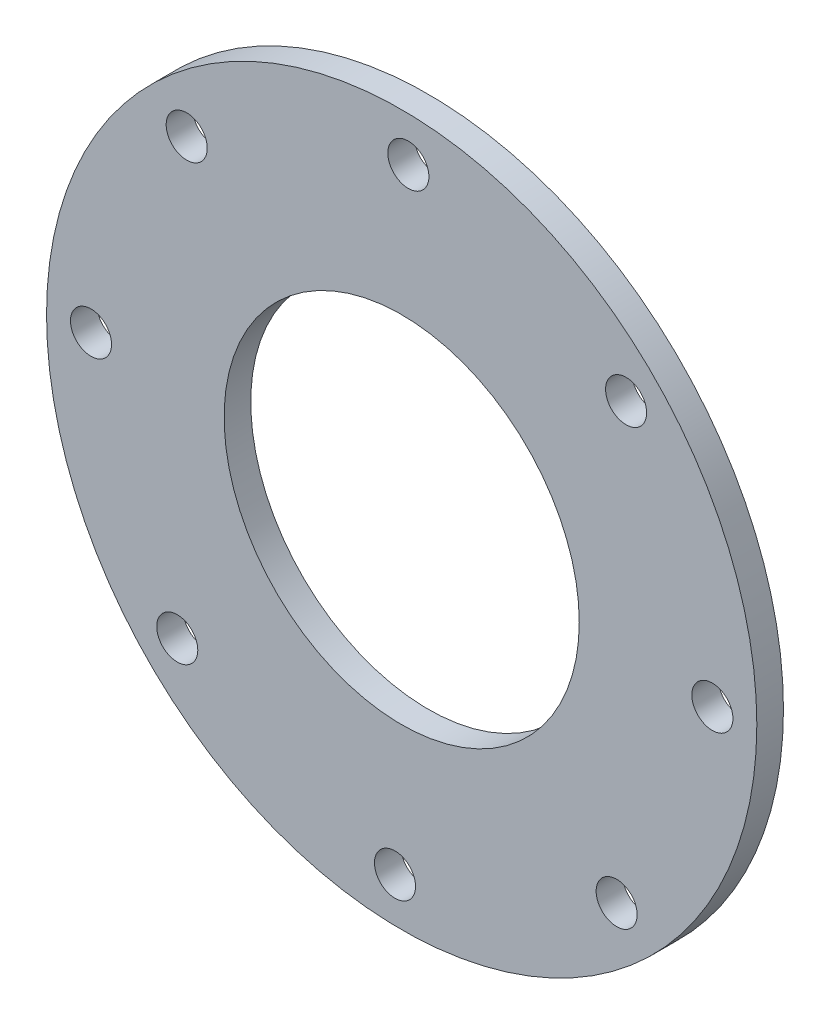
ISO-10303-21;
HEADER;
FILE_DESCRIPTION(('STEP AP214'),'2;1');
FILE_NAME('part.step','',(''),(''),'','','');
FILE_SCHEMA(('AUTOMOTIVE_DESIGN { 1 0 10303 214 1 1 1 1 }'));
ENDSEC;
DATA;
#1=APPLICATION_CONTEXT('core data for automotive mechanical design processes');
#2=APPLICATION_PROTOCOL_DEFINITION('international standard','automotive_design',2000,#1);
#3=PRODUCT_CONTEXT('',#1,'mechanical');
#4=PRODUCT('Part','Part','',(#3));
#5=PRODUCT_RELATED_PRODUCT_CATEGORY('part','',(#4));
#6=PRODUCT_DEFINITION_FORMATION('','',#4);
#7=PRODUCT_DEFINITION_CONTEXT('part definition',#1,'design');
#8=PRODUCT_DEFINITION('design','',#6,#7);
#9=PRODUCT_DEFINITION_SHAPE('','',#8);
#10=(LENGTH_UNIT() NAMED_UNIT(*) SI_UNIT(.MILLI.,.METRE.));
#11=(NAMED_UNIT(*) PLANE_ANGLE_UNIT() SI_UNIT($,.RADIAN.));
#12=(NAMED_UNIT(*) SI_UNIT($,.STERADIAN.) SOLID_ANGLE_UNIT());
#13=UNCERTAINTY_MEASURE_WITH_UNIT(LENGTH_MEASURE(1.E-05),#10,'distance_accuracy_value','');
#14=(GEOMETRIC_REPRESENTATION_CONTEXT(3) GLOBAL_UNCERTAINTY_ASSIGNED_CONTEXT((#13)) GLOBAL_UNIT_ASSIGNED_CONTEXT((#10,
#11,#12)) REPRESENTATION_CONTEXT('',''));
#15=CARTESIAN_POINT('',(0.,0.,0.));
#16=DIRECTION('',(0.,0.,1.));
#17=DIRECTION('',(1.,0.,0.));
#18=AXIS2_PLACEMENT_3D('',#15,#16,#17);
#19=CARTESIAN_POINT('',(0.,0.,6.));
#20=DIRECTION('',(0.,0.,1.));
#21=DIRECTION('',(1.,0.,0.));
#22=AXIS2_PLACEMENT_3D('',#19,#20,#21);
#23=PLANE('',#22);
#24=CARTESIAN_POINT('',(-101.100068535297,-96.8440816062343,6.));
#25=DIRECTION('',(0.,0.,1.));
#26=DIRECTION('',(1.,0.,0.));
#27=AXIS2_PLACEMENT_3D('',#24,#25,#26);
#28=CIRCLE('',#27,9.2500000000066);
#29=CARTESIAN_POINT('',(-91.8500685352901,-96.8440816062343,6.));
#30=VERTEX_POINT('',#29);
#31=EDGE_CURVE('E83',#30,#30,#28,.T.);
#32=ORIENTED_EDGE('',*,*,#31,.F.);
#33=EDGE_LOOP('',(#32));
#34=FACE_BOUND('',#33,.T.);
#35=CARTESIAN_POINT('',(96.8440816062512,-101.100068535297,6.));
#36=DIRECTION('',(0.,0.,1.));
#37=DIRECTION('',(1.,0.,0.));
#38=AXIS2_PLACEMENT_3D('',#35,#36,#37);
#39=CIRCLE('',#38,9.2500000000222);
#40=CARTESIAN_POINT('',(106.094081606273,-101.100068535297,6.));
#41=VERTEX_POINT('',#40);
#42=EDGE_CURVE('E71',#41,#41,#39,.T.);
#43=ORIENTED_EDGE('',*,*,#42,.F.);
#44=EDGE_LOOP('',(#43));
#45=FACE_BOUND('',#44,.T.);
#46=CARTESIAN_POINT('',(101.100068535314,96.8440816062508,6.));
#47=DIRECTION('',(0.,0.,1.));
#48=DIRECTION('',(1.,0.,0.));
#49=AXIS2_PLACEMENT_3D('',#46,#47,#48);
#50=CIRCLE('',#49,9.25000000001643);
#51=CARTESIAN_POINT('',(110.35006853533,96.8440816062508,6.));
#52=VERTEX_POINT('',#51);
#53=EDGE_CURVE('E59',#52,#52,#50,.T.);
#54=ORIENTED_EDGE('',*,*,#53,.F.);
#55=EDGE_LOOP('',(#54));
#56=FACE_BOUND('',#55,.T.);
#57=CARTESIAN_POINT('',(-96.8440816062339,101.100068535314,6.));
#58=DIRECTION('',(0.,0.,1.));
#59=DIRECTION('',(1.,0.,0.));
#60=AXIS2_PLACEMENT_3D('',#57,#58,#59);
#61=CIRCLE('',#60,9.24999999999999);
#62=CARTESIAN_POINT('',(-87.5940816062339,101.100068535314,6.));
#63=VERTEX_POINT('',#62);
#64=EDGE_CURVE('E47',#63,#63,#61,.T.);
#65=ORIENTED_EDGE('',*,*,#64,.F.);
#66=EDGE_LOOP('',(#65));
#67=FACE_BOUND('',#66,.T.);
#68=CARTESIAN_POINT('',(0.,0.,6.));
#69=DIRECTION('',(0.,0.,1.));
#70=DIRECTION('',(1.,0.,0.));
#71=AXIS2_PLACEMENT_3D('',#68,#69,#70);
#72=CIRCLE('',#71,160.);
#73=CARTESIAN_POINT('',(160.,0.,6.));
#74=VERTEX_POINT('',#73);
#75=EDGE_CURVE('E10',#74,#74,#72,.T.);
#76=ORIENTED_EDGE('',*,*,#75,.T.);
#77=EDGE_LOOP('',(#76));
#78=FACE_BOUND('',#77,.T.);
#79=CARTESIAN_POINT('',(0.,0.,6.));
#80=DIRECTION('',(0.,0.,1.));
#81=DIRECTION('',(1.,0.,0.));
#82=AXIS2_PLACEMENT_3D('',#79,#80,#81);
#83=CIRCLE('',#82,80.);
#84=CARTESIAN_POINT('',(80.,0.,6.));
#85=VERTEX_POINT('',#84);
#86=EDGE_CURVE('E42',#85,#85,#83,.T.);
#87=ORIENTED_EDGE('',*,*,#86,.F.);
#88=EDGE_LOOP('',(#87));
#89=FACE_BOUND('',#88,.T.);
#90=CARTESIAN_POINT('',(3.00943721819025,139.967650861305,6.));
#91=DIRECTION('',(0.,0.,1.));
#92=DIRECTION('',(1.,0.,0.));
#93=AXIS2_PLACEMENT_3D('',#90,#91,#92);
#94=CIRCLE('',#93,9.25000000000713);
#95=CARTESIAN_POINT('',(12.2594372181974,139.967650861305,6.));
#96=VERTEX_POINT('',#95);
#97=EDGE_CURVE('E53',#96,#96,#94,.T.);
#98=ORIENTED_EDGE('',*,*,#97,.F.);
#99=EDGE_LOOP('',(#98));
#100=FACE_BOUND('',#99,.T.);
#101=CARTESIAN_POINT('',(139.967650861305,-3.00943721817337,6.));
#102=DIRECTION('',(0.,0.,1.));
#103=DIRECTION('',(1.,0.,0.));
#104=AXIS2_PLACEMENT_3D('',#101,#102,#103);
#105=CIRCLE('',#104,9.25000000002262);
#106=CARTESIAN_POINT('',(149.217650861328,-3.00943721817337,6.));
#107=VERTEX_POINT('',#106);
#108=EDGE_CURVE('E65',#107,#107,#105,.T.);
#109=ORIENTED_EDGE('',*,*,#108,.F.);
#110=EDGE_LOOP('',(#109));
#111=FACE_BOUND('',#110,.T.);
#112=CARTESIAN_POINT('',(-3.009437218173,-139.967650861288,6.));
#113=DIRECTION('',(0.,0.,1.));
#114=DIRECTION('',(1.,0.,0.));
#115=AXIS2_PLACEMENT_3D('',#112,#113,#114);
#116=CIRCLE('',#115,9.25000000001548);
#117=CARTESIAN_POINT('',(6.24056278184248,-139.967650861288,6.));
#118=VERTEX_POINT('',#117);
#119=EDGE_CURVE('E77',#118,#118,#116,.T.);
#120=ORIENTED_EDGE('',*,*,#119,.F.);
#121=EDGE_LOOP('',(#120));
#122=FACE_BOUND('',#121,.T.);
#123=CARTESIAN_POINT('',(-139.967650861288,3.00943721818985,6.));
#124=DIRECTION('',(0.,0.,1.));
#125=DIRECTION('',(1.,0.,0.));
#126=AXIS2_PLACEMENT_3D('',#123,#124,#125);
#127=CIRCLE('',#126,9.25000000000084);
#128=CARTESIAN_POINT('',(-130.717650861287,3.00943721818985,6.));
#129=VERTEX_POINT('',#128);
#130=EDGE_CURVE('E89',#129,#129,#127,.T.);
#131=ORIENTED_EDGE('',*,*,#130,.F.);
#132=EDGE_LOOP('',(#131));
#133=FACE_BOUND('',#132,.T.);
#134=ADVANCED_FACE('F31',(#34,#45,#56,#67,#78,#89,#100,#111,#122,#133),#23,.T.);
#135=CARTESIAN_POINT('',(0.,0.,-6.));
#136=DIRECTION('',(0.,0.,1.));
#137=DIRECTION('',(1.,0.,0.));
#138=AXIS2_PLACEMENT_3D('',#135,#136,#137);
#139=PLANE('',#138);
#140=CARTESIAN_POINT('',(0.,0.,-6.));
#141=DIRECTION('',(0.,0.,1.));
#142=DIRECTION('',(1.,0.,0.));
#143=AXIS2_PLACEMENT_3D('',#140,#141,#142);
#144=CIRCLE('',#143,160.);
#145=CARTESIAN_POINT('',(160.,0.,-6.));
#146=VERTEX_POINT('',#145);
#147=EDGE_CURVE('E35',#146,#146,#144,.T.);
#148=ORIENTED_EDGE('',*,*,#147,.F.);
#149=EDGE_LOOP('',(#148));
#150=FACE_BOUND('',#149,.T.);
#151=CARTESIAN_POINT('',(0.,0.,-6.));
#152=DIRECTION('',(0.,0.,1.));
#153=DIRECTION('',(1.,0.,0.));
#154=AXIS2_PLACEMENT_3D('',#151,#152,#153);
#155=CIRCLE('',#154,80.);
#156=CARTESIAN_POINT('',(80.,0.,-6.));
#157=VERTEX_POINT('',#156);
#158=EDGE_CURVE('E44',#157,#157,#155,.T.);
#159=ORIENTED_EDGE('',*,*,#158,.T.);
#160=EDGE_LOOP('',(#159));
#161=FACE_BOUND('',#160,.T.);
#162=CARTESIAN_POINT('',(-96.8440816062339,101.100068535314,-6.));
#163=DIRECTION('',(0.,0.,1.));
#164=DIRECTION('',(1.,0.,0.));
#165=AXIS2_PLACEMENT_3D('',#162,#163,#164);
#166=CIRCLE('',#165,9.24999999999999);
#167=CARTESIAN_POINT('',(-87.5940816062339,101.100068535314,-6.));
#168=VERTEX_POINT('',#167);
#169=EDGE_CURVE('E50',#168,#168,#166,.T.);
#170=ORIENTED_EDGE('',*,*,#169,.T.);
#171=EDGE_LOOP('',(#170));
#172=FACE_BOUND('',#171,.T.);
#173=CARTESIAN_POINT('',(3.00943721819025,139.967650861305,-6.));
#174=DIRECTION('',(0.,0.,1.));
#175=DIRECTION('',(1.,0.,0.));
#176=AXIS2_PLACEMENT_3D('',#173,#174,#175);
#177=CIRCLE('',#176,9.25000000000713);
#178=CARTESIAN_POINT('',(12.2594372181974,139.967650861305,-6.));
#179=VERTEX_POINT('',#178);
#180=EDGE_CURVE('E56',#179,#179,#177,.T.);
#181=ORIENTED_EDGE('',*,*,#180,.T.);
#182=EDGE_LOOP('',(#181));
#183=FACE_BOUND('',#182,.T.);
#184=CARTESIAN_POINT('',(101.100068535314,96.8440816062508,-6.));
#185=DIRECTION('',(0.,0.,1.));
#186=DIRECTION('',(1.,0.,0.));
#187=AXIS2_PLACEMENT_3D('',#184,#185,#186);
#188=CIRCLE('',#187,9.25000000001643);
#189=CARTESIAN_POINT('',(110.35006853533,96.8440816062508,-6.));
#190=VERTEX_POINT('',#189);
#191=EDGE_CURVE('E62',#190,#190,#188,.T.);
#192=ORIENTED_EDGE('',*,*,#191,.T.);
#193=EDGE_LOOP('',(#192));
#194=FACE_BOUND('',#193,.T.);
#195=CARTESIAN_POINT('',(139.967650861305,-3.00943721817337,-6.));
#196=DIRECTION('',(0.,0.,1.));
#197=DIRECTION('',(1.,0.,0.));
#198=AXIS2_PLACEMENT_3D('',#195,#196,#197);
#199=CIRCLE('',#198,9.25000000002262);
#200=CARTESIAN_POINT('',(149.217650861328,-3.00943721817337,-6.));
#201=VERTEX_POINT('',#200);
#202=EDGE_CURVE('E68',#201,#201,#199,.T.);
#203=ORIENTED_EDGE('',*,*,#202,.T.);
#204=EDGE_LOOP('',(#203));
#205=FACE_BOUND('',#204,.T.);
#206=CARTESIAN_POINT('',(96.8440816062512,-101.100068535297,-6.));
#207=DIRECTION('',(0.,0.,1.));
#208=DIRECTION('',(1.,0.,0.));
#209=AXIS2_PLACEMENT_3D('',#206,#207,#208);
#210=CIRCLE('',#209,9.2500000000222);
#211=CARTESIAN_POINT('',(106.094081606273,-101.100068535297,-6.));
#212=VERTEX_POINT('',#211);
#213=EDGE_CURVE('E74',#212,#212,#210,.T.);
#214=ORIENTED_EDGE('',*,*,#213,.T.);
#215=EDGE_LOOP('',(#214));
#216=FACE_BOUND('',#215,.T.);
#217=CARTESIAN_POINT('',(-3.009437218173,-139.967650861288,-6.));
#218=DIRECTION('',(0.,0.,1.));
#219=DIRECTION('',(1.,0.,0.));
#220=AXIS2_PLACEMENT_3D('',#217,#218,#219);
#221=CIRCLE('',#220,9.25000000001548);
#222=CARTESIAN_POINT('',(6.24056278184248,-139.967650861288,-6.));
#223=VERTEX_POINT('',#222);
#224=EDGE_CURVE('E80',#223,#223,#221,.T.);
#225=ORIENTED_EDGE('',*,*,#224,.T.);
#226=EDGE_LOOP('',(#225));
#227=FACE_BOUND('',#226,.T.);
#228=CARTESIAN_POINT('',(-101.100068535297,-96.8440816062343,-6.));
#229=DIRECTION('',(0.,0.,1.));
#230=DIRECTION('',(1.,0.,0.));
#231=AXIS2_PLACEMENT_3D('',#228,#229,#230);
#232=CIRCLE('',#231,9.2500000000066);
#233=CARTESIAN_POINT('',(-91.8500685352901,-96.8440816062343,-6.));
#234=VERTEX_POINT('',#233);
#235=EDGE_CURVE('E86',#234,#234,#232,.T.);
#236=ORIENTED_EDGE('',*,*,#235,.T.);
#237=EDGE_LOOP('',(#236));
#238=FACE_BOUND('',#237,.T.);
#239=CARTESIAN_POINT('',(-139.967650861288,3.00943721818985,-6.));
#240=DIRECTION('',(0.,0.,1.));
#241=DIRECTION('',(1.,0.,0.));
#242=AXIS2_PLACEMENT_3D('',#239,#240,#241);
#243=CIRCLE('',#242,9.25000000000084);
#244=CARTESIAN_POINT('',(-130.717650861287,3.00943721818985,-6.));
#245=VERTEX_POINT('',#244);
#246=EDGE_CURVE('E92',#245,#245,#243,.T.);
#247=ORIENTED_EDGE('',*,*,#246,.T.);
#248=EDGE_LOOP('',(#247));
#249=FACE_BOUND('',#248,.T.);
#250=ADVANCED_FACE('F102',(#150,#161,#172,#183,#194,#205,#216,#227,#238,#249),#139,.F.);
#251=CARTESIAN_POINT('',(0.,0.,6.));
#252=DIRECTION('',(0.,0.,-1.));
#253=DIRECTION('',(-1.,0.,0.));
#254=AXIS2_PLACEMENT_3D('',#251,#252,#253);
#255=CYLINDRICAL_SURFACE('',#254,160.);
#256=ORIENTED_EDGE('',*,*,#75,.F.);
#257=EDGE_LOOP('',(#256));
#258=FACE_BOUND('',#257,.T.);
#259=ORIENTED_EDGE('',*,*,#147,.T.);
#260=EDGE_LOOP('',(#259));
#261=FACE_BOUND('',#260,.T.);
#262=ADVANCED_FACE('F33',(#258,#261),#255,.T.);
#263=CARTESIAN_POINT('',(0.,0.,6.));
#264=DIRECTION('',(0.,0.,-1.));
#265=DIRECTION('',(-1.,0.,0.));
#266=AXIS2_PLACEMENT_3D('',#263,#264,#265);
#267=CYLINDRICAL_SURFACE('',#266,80.);
#268=ORIENTED_EDGE('',*,*,#86,.T.);
#269=EDGE_LOOP('',(#268));
#270=FACE_BOUND('',#269,.T.);
#271=ORIENTED_EDGE('',*,*,#158,.F.);
#272=EDGE_LOOP('',(#271));
#273=FACE_BOUND('',#272,.T.);
#274=ADVANCED_FACE('F112',(#270,#273),#267,.F.);
#275=CARTESIAN_POINT('',(-96.8440816062339,101.100068535314,6.));
#276=DIRECTION('',(0.,0.,-1.));
#277=DIRECTION('',(-1.,0.,0.));
#278=AXIS2_PLACEMENT_3D('',#275,#276,#277);
#279=CYLINDRICAL_SURFACE('',#278,9.24999999999999);
#280=ORIENTED_EDGE('',*,*,#64,.T.);
#281=EDGE_LOOP('',(#280));
#282=FACE_BOUND('',#281,.T.);
#283=ORIENTED_EDGE('',*,*,#169,.F.);
#284=EDGE_LOOP('',(#283));
#285=FACE_BOUND('',#284,.T.);
#286=ADVANCED_FACE('F115',(#282,#285),#279,.F.);
#287=CARTESIAN_POINT('',(3.00943721819025,139.967650861305,6.));
#288=DIRECTION('',(0.,0.,-1.));
#289=DIRECTION('',(-1.,0.,0.));
#290=AXIS2_PLACEMENT_3D('',#287,#288,#289);
#291=CYLINDRICAL_SURFACE('',#290,9.25000000000713);
#292=ORIENTED_EDGE('',*,*,#97,.T.);
#293=EDGE_LOOP('',(#292));
#294=FACE_BOUND('',#293,.T.);
#295=ORIENTED_EDGE('',*,*,#180,.F.);
#296=EDGE_LOOP('',(#295));
#297=FACE_BOUND('',#296,.T.);
#298=ADVANCED_FACE('F119',(#294,#297),#291,.F.);
#299=CARTESIAN_POINT('',(101.100068535314,96.8440816062508,6.));
#300=DIRECTION('',(0.,0.,-1.));
#301=DIRECTION('',(-1.,0.,0.));
#302=AXIS2_PLACEMENT_3D('',#299,#300,#301);
#303=CYLINDRICAL_SURFACE('',#302,9.25000000001643);
#304=ORIENTED_EDGE('',*,*,#53,.T.);
#305=EDGE_LOOP('',(#304));
#306=FACE_BOUND('',#305,.T.);
#307=ORIENTED_EDGE('',*,*,#191,.F.);
#308=EDGE_LOOP('',(#307));
#309=FACE_BOUND('',#308,.T.);
#310=ADVANCED_FACE('F123',(#306,#309),#303,.F.);
#311=CARTESIAN_POINT('',(139.967650861305,-3.00943721817337,6.));
#312=DIRECTION('',(0.,0.,-1.));
#313=DIRECTION('',(-1.,0.,0.));
#314=AXIS2_PLACEMENT_3D('',#311,#312,#313);
#315=CYLINDRICAL_SURFACE('',#314,9.25000000002262);
#316=ORIENTED_EDGE('',*,*,#108,.T.);
#317=EDGE_LOOP('',(#316));
#318=FACE_BOUND('',#317,.T.);
#319=ORIENTED_EDGE('',*,*,#202,.F.);
#320=EDGE_LOOP('',(#319));
#321=FACE_BOUND('',#320,.T.);
#322=ADVANCED_FACE('F127',(#318,#321),#315,.F.);
#323=CARTESIAN_POINT('',(96.8440816062512,-101.100068535297,6.));
#324=DIRECTION('',(0.,0.,-1.));
#325=DIRECTION('',(-1.,0.,0.));
#326=AXIS2_PLACEMENT_3D('',#323,#324,#325);
#327=CYLINDRICAL_SURFACE('',#326,9.2500000000222);
#328=ORIENTED_EDGE('',*,*,#42,.T.);
#329=EDGE_LOOP('',(#328));
#330=FACE_BOUND('',#329,.T.);
#331=ORIENTED_EDGE('',*,*,#213,.F.);
#332=EDGE_LOOP('',(#331));
#333=FACE_BOUND('',#332,.T.);
#334=ADVANCED_FACE('F131',(#330,#333),#327,.F.);
#335=CARTESIAN_POINT('',(-3.009437218173,-139.967650861288,6.));
#336=DIRECTION('',(0.,0.,-1.));
#337=DIRECTION('',(-1.,0.,0.));
#338=AXIS2_PLACEMENT_3D('',#335,#336,#337);
#339=CYLINDRICAL_SURFACE('',#338,9.25000000001548);
#340=ORIENTED_EDGE('',*,*,#119,.T.);
#341=EDGE_LOOP('',(#340));
#342=FACE_BOUND('',#341,.T.);
#343=ORIENTED_EDGE('',*,*,#224,.F.);
#344=EDGE_LOOP('',(#343));
#345=FACE_BOUND('',#344,.T.);
#346=ADVANCED_FACE('F135',(#342,#345),#339,.F.);
#347=CARTESIAN_POINT('',(-101.100068535297,-96.8440816062343,6.));
#348=DIRECTION('',(0.,0.,-1.));
#349=DIRECTION('',(-1.,0.,0.));
#350=AXIS2_PLACEMENT_3D('',#347,#348,#349);
#351=CYLINDRICAL_SURFACE('',#350,9.2500000000066);
#352=ORIENTED_EDGE('',*,*,#31,.T.);
#353=EDGE_LOOP('',(#352));
#354=FACE_BOUND('',#353,.T.);
#355=ORIENTED_EDGE('',*,*,#235,.F.);
#356=EDGE_LOOP('',(#355));
#357=FACE_BOUND('',#356,.T.);
#358=ADVANCED_FACE('F139',(#354,#357),#351,.F.);
#359=CARTESIAN_POINT('',(-139.967650861288,3.00943721818985,6.));
#360=DIRECTION('',(0.,0.,-1.));
#361=DIRECTION('',(-1.,0.,0.));
#362=AXIS2_PLACEMENT_3D('',#359,#360,#361);
#363=CYLINDRICAL_SURFACE('',#362,9.25000000000084);
#364=ORIENTED_EDGE('',*,*,#130,.T.);
#365=EDGE_LOOP('',(#364));
#366=FACE_BOUND('',#365,.T.);
#367=ORIENTED_EDGE('',*,*,#246,.F.);
#368=EDGE_LOOP('',(#367));
#369=FACE_BOUND('',#368,.T.);
#370=ADVANCED_FACE('F98',(#366,#369),#363,.F.);
#371=CLOSED_SHELL('',(#134,#250,#262,#274,#286,#298,#310,#322,#334,#346,#358,#370));
#372=MANIFOLD_SOLID_BREP('B2',#371);
#373=ADVANCED_BREP_SHAPE_REPRESENTATION('',(#18,#372),#14);
#374=SHAPE_DEFINITION_REPRESENTATION(#9,#373);
ENDSEC;
END-ISO-10303-21;
